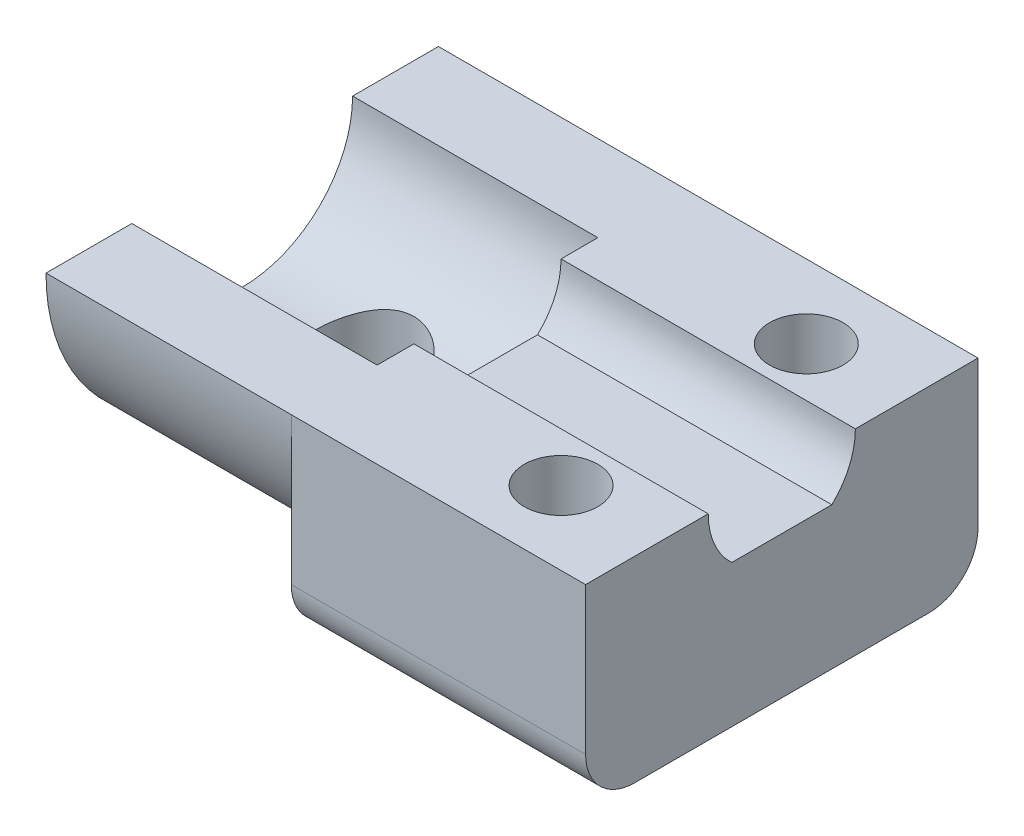
ISO-10303-21;
HEADER;
FILE_DESCRIPTION(('STEP AP214'),'2;1');
FILE_NAME('part.step','',(''),(''),'','','');
FILE_SCHEMA(('AUTOMOTIVE_DESIGN { 1 0 10303 214 1 1 1 1 }'));
ENDSEC;
DATA;
#1=APPLICATION_CONTEXT('core data for automotive mechanical design processes');
#2=APPLICATION_PROTOCOL_DEFINITION('international standard','automotive_design',2000,#1);
#3=PRODUCT_CONTEXT('',#1,'mechanical');
#4=PRODUCT('Part','Part','',(#3));
#5=PRODUCT_RELATED_PRODUCT_CATEGORY('part','',(#4));
#6=PRODUCT_DEFINITION_FORMATION('','',#4);
#7=PRODUCT_DEFINITION_CONTEXT('part definition',#1,'design');
#8=PRODUCT_DEFINITION('design','',#6,#7);
#9=PRODUCT_DEFINITION_SHAPE('','',#8);
#10=(LENGTH_UNIT() NAMED_UNIT(*) SI_UNIT(.MILLI.,.METRE.));
#11=(NAMED_UNIT(*) PLANE_ANGLE_UNIT() SI_UNIT($,.RADIAN.));
#12=(NAMED_UNIT(*) SI_UNIT($,.STERADIAN.) SOLID_ANGLE_UNIT());
#13=UNCERTAINTY_MEASURE_WITH_UNIT(LENGTH_MEASURE(1.E-05),#10,'distance_accuracy_value','');
#14=(GEOMETRIC_REPRESENTATION_CONTEXT(3) GLOBAL_UNCERTAINTY_ASSIGNED_CONTEXT((#13)) GLOBAL_UNIT_ASSIGNED_CONTEXT((#10,
#11,#12)) REPRESENTATION_CONTEXT('',''));
#15=CARTESIAN_POINT('',(0.,0.,0.));
#16=DIRECTION('',(0.,0.,1.));
#17=DIRECTION('',(1.,0.,0.));
#18=AXIS2_PLACEMENT_3D('',#15,#16,#17);
#19=CARTESIAN_POINT('',(-6.,8.,-8.00000000000001));
#20=DIRECTION('',(1.,0.,0.));
#21=DIRECTION('',(0.,0.,-1.));
#22=AXIS2_PLACEMENT_3D('',#19,#20,#21);
#23=PLANE('',#22);
#24=DIRECTION('',(0.,-1.,0.));
#25=VECTOR('',#24,1.);
#26=CARTESIAN_POINT('',(-6.,8.,-8.00000000000001));
#27=LINE('',#26,#25);
#28=CARTESIAN_POINT('',(-6.,8.,-8.00000000000001));
#29=VERTEX_POINT('',#28);
#30=CARTESIAN_POINT('',(-6.,2.,-8.00000000000001));
#31=VERTEX_POINT('',#30);
#32=EDGE_CURVE('E297',#29,#31,#27,.T.);
#33=ORIENTED_EDGE('',*,*,#32,.T.);
#34=CARTESIAN_POINT('',(-6.,2.,-6.00000000000001));
#35=DIRECTION('',(1.,0.,0.));
#36=DIRECTION('',(0.,0.,-1.));
#37=AXIS2_PLACEMENT_3D('',#34,#35,#36);
#38=CIRCLE('',#37,2.);
#39=CARTESIAN_POINT('',(-6.,0.,-6.00000000000001));
#40=VERTEX_POINT('',#39);
#41=EDGE_CURVE('E48',#31,#40,#38,.F.);
#42=ORIENTED_EDGE('',*,*,#41,.T.);
#43=DIRECTION('',(0.,0.,1.));
#44=VECTOR('',#43,1.);
#45=CARTESIAN_POINT('',(-6.,0.,-8.00000000000001));
#46=LINE('',#45,#44);
#47=CARTESIAN_POINT('',(-6.,0.,0.));
#48=VERTEX_POINT('',#47);
#49=EDGE_CURVE('E299',#40,#48,#46,.T.);
#50=ORIENTED_EDGE('',*,*,#49,.T.);
#51=CARTESIAN_POINT('',(-6.,8.,0.));
#52=DIRECTION('',(-1.,0.,0.));
#53=DIRECTION('',(0.,0.,1.));
#54=AXIS2_PLACEMENT_3D('',#51,#52,#53);
#55=CIRCLE('',#54,8.);
#56=EDGE_CURVE('E235',#29,#48,#55,.T.);
#57=ORIENTED_EDGE('',*,*,#56,.F.);
#58=EDGE_LOOP('',(#33,#42,#50,#57));
#59=FACE_BOUND('',#58,.T.);
#60=ADVANCED_FACE('F34',(#59),#23,.F.);
#61=CARTESIAN_POINT('',(-6.,0.,5.99999999999999));
#62=VERTEX_POINT('',#61);
#63=EDGE_CURVE('E301',#48,#62,#46,.T.);
#64=ORIENTED_EDGE('',*,*,#63,.T.);
#65=CARTESIAN_POINT('',(-6.,2.,5.99999999999999));
#66=DIRECTION('',(1.,0.,0.));
#67=DIRECTION('',(0.,0.,-1.));
#68=AXIS2_PLACEMENT_3D('',#65,#66,#67);
#69=CIRCLE('',#68,2.);
#70=CARTESIAN_POINT('',(-6.,2.,7.99999999999999));
#71=VERTEX_POINT('',#70);
#72=EDGE_CURVE('E342',#62,#71,#69,.F.);
#73=ORIENTED_EDGE('',*,*,#72,.T.);
#74=DIRECTION('',(0.,-1.,0.));
#75=VECTOR('',#74,1.);
#76=CARTESIAN_POINT('',(-6.,8.,7.99999999999999));
#77=LINE('',#76,#75);
#78=CARTESIAN_POINT('',(-6.,8.,7.99999999999999));
#79=VERTEX_POINT('',#78);
#80=EDGE_CURVE('E306',#79,#71,#77,.T.);
#81=ORIENTED_EDGE('',*,*,#80,.F.);
#82=EDGE_CURVE('E179',#48,#79,#55,.T.);
#83=ORIENTED_EDGE('',*,*,#82,.F.);
#84=EDGE_LOOP('',(#64,#73,#81,#83));
#85=FACE_BOUND('',#84,.T.);
#86=ADVANCED_FACE('F269',(#85),#23,.F.);
#87=CARTESIAN_POINT('',(-6.,8.,0.));
#88=DIRECTION('',(1.,0.,0.));
#89=DIRECTION('',(0.,0.,1.));
#90=AXIS2_PLACEMENT_3D('',#87,#88,#89);
#91=CIRCLE('',#90,4.5);
#92=CARTESIAN_POINT('',(-6.,8.,4.49999999999999));
#93=VERTEX_POINT('',#92);
#94=CARTESIAN_POINT('',(-6.,8.,-4.50000000000001));
#95=VERTEX_POINT('',#94);
#96=EDGE_CURVE('E173',#93,#95,#91,.T.);
#97=ORIENTED_EDGE('',*,*,#96,.F.);
#98=DIRECTION('',(0.,0.,1.));
#99=VECTOR('',#98,1.);
#100=CARTESIAN_POINT('',(-6.,8.,-8.00000000000001));
#101=LINE('',#100,#99);
#102=CARTESIAN_POINT('',(-6.,8.,3.));
#103=VERTEX_POINT('',#102);
#104=EDGE_CURVE('E222',#103,#93,#101,.T.);
#105=ORIENTED_EDGE('',*,*,#104,.F.);
#106=CARTESIAN_POINT('',(-6.,8.,0.));
#107=DIRECTION('',(1.,0.,0.));
#108=DIRECTION('',(0.,0.,-1.));
#109=AXIS2_PLACEMENT_3D('',#106,#107,#108);
#110=CIRCLE('',#109,3.);
#111=CARTESIAN_POINT('',(-6.,5.8,2.03960780543711));
#112=VERTEX_POINT('',#111);
#113=EDGE_CURVE('E325',#103,#112,#110,.T.);
#114=ORIENTED_EDGE('',*,*,#113,.T.);
#115=DIRECTION('',(0.,0.,-1.));
#116=VECTOR('',#115,1.);
#117=CARTESIAN_POINT('',(-6.,5.8,-8.00000000000001));
#118=LINE('',#117,#116);
#119=CARTESIAN_POINT('',(-6.,5.8,-2.03960780543711));
#120=VERTEX_POINT('',#119);
#121=EDGE_CURVE('E323',#112,#120,#118,.T.);
#122=ORIENTED_EDGE('',*,*,#121,.T.);
#123=CARTESIAN_POINT('',(-6.,8.,-3.));
#124=VERTEX_POINT('',#123);
#125=EDGE_CURVE('E309',#120,#124,#110,.T.);
#126=ORIENTED_EDGE('',*,*,#125,.T.);
#127=EDGE_CURVE('E229',#95,#124,#101,.T.);
#128=ORIENTED_EDGE('',*,*,#127,.F.);
#129=EDGE_LOOP('',(#97,#105,#114,#122,#126,#128));
#130=FACE_BOUND('',#129,.T.);
#131=ADVANCED_FACE('F272',(#130),#23,.F.);
#132=CARTESIAN_POINT('',(0.,8.,0.));
#133=DIRECTION('',(0.,1.,0.));
#134=DIRECTION('',(0.,0.,1.));
#135=AXIS2_PLACEMENT_3D('',#132,#133,#134);
#136=PLANE('',#135);
#137=DIRECTION('',(1.,0.,0.));
#138=VECTOR('',#137,1.);
#139=CARTESIAN_POINT('',(-19.,8.,3.));
#140=LINE('',#139,#138);
#141=CARTESIAN_POINT('',(6.,8.,3.));
#142=VERTEX_POINT('',#141);
#143=EDGE_CURVE('E196',#103,#142,#140,.T.);
#144=ORIENTED_EDGE('',*,*,#143,.F.);
#145=ORIENTED_EDGE('',*,*,#104,.T.);
#146=DIRECTION('',(1.,0.,0.));
#147=VECTOR('',#146,1.);
#148=CARTESIAN_POINT('',(-16.,8.,4.5));
#149=LINE('',#148,#147);
#150=CARTESIAN_POINT('',(-16.,8.,4.5));
#151=VERTEX_POINT('',#150);
#152=EDGE_CURVE('E160',#151,#93,#149,.T.);
#153=ORIENTED_EDGE('',*,*,#152,.F.);
#154=DIRECTION('',(0.,0.,-1.));
#155=VECTOR('',#154,1.);
#156=CARTESIAN_POINT('',(-16.,8.,4.5));
#157=LINE('',#156,#155);
#158=CARTESIAN_POINT('',(-16.,8.,8.));
#159=VERTEX_POINT('',#158);
#160=EDGE_CURVE('E151',#159,#151,#157,.T.);
#161=ORIENTED_EDGE('',*,*,#160,.F.);
#162=DIRECTION('',(1.,0.,0.));
#163=VECTOR('',#162,1.);
#164=CARTESIAN_POINT('',(-16.,8.,8.));
#165=LINE('',#164,#163);
#166=EDGE_CURVE('E157',#159,#79,#165,.T.);
#167=ORIENTED_EDGE('',*,*,#166,.T.);
#168=DIRECTION('',(1.,0.,0.));
#169=VECTOR('',#168,1.);
#170=CARTESIAN_POINT('',(-6.,8.,7.99999999999999));
#171=LINE('',#170,#169);
#172=CARTESIAN_POINT('',(6.,8.,7.99999999999999));
#173=VERTEX_POINT('',#172);
#174=EDGE_CURVE('E225',#79,#173,#171,.T.);
#175=ORIENTED_EDGE('',*,*,#174,.T.);
#176=DIRECTION('',(0.,0.,-1.));
#177=VECTOR('',#176,1.);
#178=CARTESIAN_POINT('',(6.,8.,-8.00000000000001));
#179=LINE('',#178,#177);
#180=EDGE_CURVE('E215',#173,#142,#179,.T.);
#181=ORIENTED_EDGE('',*,*,#180,.T.);
#182=EDGE_LOOP('',(#144,#145,#153,#161,#167,#175,#181));
#183=FACE_BOUND('',#182,.T.);
#184=CARTESIAN_POINT('',(2.,8.,5.));
#185=DIRECTION('',(0.,1.,0.));
#186=DIRECTION('',(0.,0.,-1.));
#187=AXIS2_PLACEMENT_3D('',#184,#185,#186);
#188=CIRCLE('',#187,1.5);
#189=CARTESIAN_POINT('',(2.,8.,3.5));
#190=VERTEX_POINT('',#189);
#191=EDGE_CURVE('E204',#190,#190,#188,.T.);
#192=ORIENTED_EDGE('',*,*,#191,.F.);
#193=EDGE_LOOP('',(#192));
#194=FACE_BOUND('',#193,.T.);
#195=ADVANCED_FACE('F154',(#183,#194),#136,.T.);
#196=DIRECTION('',(1.,0.,0.));
#197=VECTOR('',#196,1.);
#198=CARTESIAN_POINT('',(-19.,8.,-3.));
#199=LINE('',#198,#197);
#200=CARTESIAN_POINT('',(6.,8.,-3.));
#201=VERTEX_POINT('',#200);
#202=EDGE_CURVE('E200',#201,#124,#199,.F.);
#203=ORIENTED_EDGE('',*,*,#202,.F.);
#204=CARTESIAN_POINT('',(6.,8.,-8.00000000000001));
#205=VERTEX_POINT('',#204);
#206=EDGE_CURVE('E219',#201,#205,#179,.T.);
#207=ORIENTED_EDGE('',*,*,#206,.T.);
#208=DIRECTION('',(-1.,0.,0.));
#209=VECTOR('',#208,1.);
#210=CARTESIAN_POINT('',(-6.,8.,-8.00000000000001));
#211=LINE('',#210,#209);
#212=EDGE_CURVE('E218',#205,#29,#211,.T.);
#213=ORIENTED_EDGE('',*,*,#212,.T.);
#214=DIRECTION('',(1.,0.,0.));
#215=VECTOR('',#214,1.);
#216=CARTESIAN_POINT('',(-16.,8.,-8.));
#217=LINE('',#216,#215);
#218=CARTESIAN_POINT('',(-16.,8.,-8.));
#219=VERTEX_POINT('',#218);
#220=EDGE_CURVE('E187',#219,#29,#217,.T.);
#221=ORIENTED_EDGE('',*,*,#220,.F.);
#222=DIRECTION('',(0.,0.,-1.));
#223=VECTOR('',#222,1.);
#224=CARTESIAN_POINT('',(-16.,8.,-8.));
#225=LINE('',#224,#223);
#226=CARTESIAN_POINT('',(-16.,8.,-4.5));
#227=VERTEX_POINT('',#226);
#228=EDGE_CURVE('E169',#227,#219,#225,.T.);
#229=ORIENTED_EDGE('',*,*,#228,.F.);
#230=DIRECTION('',(1.,0.,0.));
#231=VECTOR('',#230,1.);
#232=CARTESIAN_POINT('',(-16.,8.,-4.5));
#233=LINE('',#232,#231);
#234=EDGE_CURVE('E184',#227,#95,#233,.T.);
#235=ORIENTED_EDGE('',*,*,#234,.T.);
#236=ORIENTED_EDGE('',*,*,#127,.T.);
#237=EDGE_LOOP('',(#203,#207,#213,#221,#229,#235,#236));
#238=FACE_BOUND('',#237,.T.);
#239=CARTESIAN_POINT('',(2.,8.,-5.));
#240=DIRECTION('',(0.,1.,0.));
#241=DIRECTION('',(0.,0.,1.));
#242=AXIS2_PLACEMENT_3D('',#239,#240,#241);
#243=CIRCLE('',#242,1.5);
#244=CARTESIAN_POINT('',(2.,8.,-3.5));
#245=VERTEX_POINT('',#244);
#246=EDGE_CURVE('E209',#245,#245,#243,.T.);
#247=ORIENTED_EDGE('',*,*,#246,.F.);
#248=EDGE_LOOP('',(#247));
#249=FACE_BOUND('',#248,.T.);
#250=ADVANCED_FACE('F285',(#238,#249),#136,.T.);
#251=CARTESIAN_POINT('',(0.,0.,0.));
#252=DIRECTION('',(0.,1.,0.));
#253=DIRECTION('',(0.,0.,1.));
#254=AXIS2_PLACEMENT_3D('',#251,#252,#253);
#255=PLANE('',#254);
#256=DIRECTION('',(0.,0.,-1.));
#257=VECTOR('',#256,1.);
#258=CARTESIAN_POINT('',(6.,0.,-8.00000000000001));
#259=LINE('',#258,#257);
#260=CARTESIAN_POINT('',(6.,0.,5.99999999999999));
#261=VERTEX_POINT('',#260);
#262=CARTESIAN_POINT('',(6.,0.,-6.00000000000001));
#263=VERTEX_POINT('',#262);
#264=EDGE_CURVE('E212',#261,#263,#259,.T.);
#265=ORIENTED_EDGE('',*,*,#264,.F.);
#266=DIRECTION('',(1.,0.,0.));
#267=VECTOR('',#266,1.);
#268=CARTESIAN_POINT('',(0.,0.,5.99999999999999));
#269=LINE('',#268,#267);
#270=CARTESIAN_POINT('',(3.1180339887499,0.,5.99999999999999));
#271=VERTEX_POINT('',#270);
#272=EDGE_CURVE('E62',#261,#271,#269,.F.);
#273=ORIENTED_EDGE('',*,*,#272,.T.);
#274=CARTESIAN_POINT('',(2.,0.,5.));
#275=DIRECTION('',(0.,1.,0.));
#276=DIRECTION('',(0.,0.,-1.));
#277=AXIS2_PLACEMENT_3D('',#274,#275,#276);
#278=CIRCLE('',#277,1.5);
#279=CARTESIAN_POINT('',(0.881966011250093,0.,5.99999999999999));
#280=VERTEX_POINT('',#279);
#281=EDGE_CURVE('E203',#271,#280,#278,.T.);
#282=ORIENTED_EDGE('',*,*,#281,.T.);
#283=DIRECTION('',(1.,0.,0.));
#284=VECTOR('',#283,1.);
#285=CARTESIAN_POINT('',(0.,0.,5.99999999999999));
#286=LINE('',#285,#284);
#287=EDGE_CURVE('E312',#280,#62,#286,.F.);
#288=ORIENTED_EDGE('',*,*,#287,.T.);
#289=ORIENTED_EDGE('',*,*,#63,.F.);
#290=ORIENTED_EDGE('',*,*,#49,.F.);
#291=DIRECTION('',(-1.,0.,0.));
#292=VECTOR('',#291,1.);
#293=CARTESIAN_POINT('',(0.,0.,-6.00000000000001));
#294=LINE('',#293,#292);
#295=CARTESIAN_POINT('',(0.881966011250103,0.,-6.00000000000001));
#296=VERTEX_POINT('',#295);
#297=EDGE_CURVE('E383',#40,#296,#294,.F.);
#298=ORIENTED_EDGE('',*,*,#297,.T.);
#299=CARTESIAN_POINT('',(2.,0.,-5.));
#300=DIRECTION('',(0.,1.,0.));
#301=DIRECTION('',(0.,0.,1.));
#302=AXIS2_PLACEMENT_3D('',#299,#300,#301);
#303=CIRCLE('',#302,1.5);
#304=CARTESIAN_POINT('',(3.11803398874989,0.,-6.00000000000001));
#305=VERTEX_POINT('',#304);
#306=EDGE_CURVE('E207',#296,#305,#303,.T.);
#307=ORIENTED_EDGE('',*,*,#306,.T.);
#308=DIRECTION('',(-1.,0.,0.));
#309=VECTOR('',#308,1.);
#310=CARTESIAN_POINT('',(0.,0.,-6.00000000000001));
#311=LINE('',#310,#309);
#312=EDGE_CURVE('E381',#305,#263,#311,.F.);
#313=ORIENTED_EDGE('',*,*,#312,.T.);
#314=EDGE_LOOP('',(#265,#273,#282,#288,#289,#290,#298,#307,#313));
#315=FACE_BOUND('',#314,.T.);
#316=ADVANCED_FACE('F310',(#315),#255,.F.);
#317=CARTESIAN_POINT('',(6.,8.,-8.00000000000001));
#318=DIRECTION('',(-1.,0.,0.));
#319=DIRECTION('',(0.,0.,1.));
#320=AXIS2_PLACEMENT_3D('',#317,#318,#319);
#321=PLANE('',#320);
#322=DIRECTION('',(0.,-1.,0.));
#323=VECTOR('',#322,1.);
#324=CARTESIAN_POINT('',(6.,8.,7.99999999999999));
#325=LINE('',#324,#323);
#326=CARTESIAN_POINT('',(6.,2.,7.99999999999999));
#327=VERTEX_POINT('',#326);
#328=EDGE_CURVE('E315',#173,#327,#325,.T.);
#329=ORIENTED_EDGE('',*,*,#328,.T.);
#330=CARTESIAN_POINT('',(6.,2.,5.99999999999999));
#331=DIRECTION('',(-1.,0.,0.));
#332=DIRECTION('',(0.,0.,1.));
#333=AXIS2_PLACEMENT_3D('',#330,#331,#332);
#334=CIRCLE('',#333,2.);
#335=EDGE_CURVE('E374',#327,#261,#334,.F.);
#336=ORIENTED_EDGE('',*,*,#335,.T.);
#337=ORIENTED_EDGE('',*,*,#264,.T.);
#338=CARTESIAN_POINT('',(6.,2.,-6.00000000000001));
#339=DIRECTION('',(-1.,0.,0.));
#340=DIRECTION('',(0.,0.,1.));
#341=AXIS2_PLACEMENT_3D('',#338,#339,#340);
#342=CIRCLE('',#341,2.);
#343=CARTESIAN_POINT('',(6.,2.,-8.00000000000001));
#344=VERTEX_POINT('',#343);
#345=EDGE_CURVE('E336',#263,#344,#342,.F.);
#346=ORIENTED_EDGE('',*,*,#345,.T.);
#347=DIRECTION('',(0.,-1.,0.));
#348=VECTOR('',#347,1.);
#349=CARTESIAN_POINT('',(6.,8.,-8.00000000000001));
#350=LINE('',#349,#348);
#351=EDGE_CURVE('E320',#205,#344,#350,.T.);
#352=ORIENTED_EDGE('',*,*,#351,.F.);
#353=ORIENTED_EDGE('',*,*,#206,.F.);
#354=CARTESIAN_POINT('',(6.,8.,0.));
#355=DIRECTION('',(1.,0.,0.));
#356=DIRECTION('',(0.,0.,-1.));
#357=AXIS2_PLACEMENT_3D('',#354,#355,#356);
#358=CIRCLE('',#357,3.);
#359=CARTESIAN_POINT('',(6.,5.8,-2.03960780543711));
#360=VERTEX_POINT('',#359);
#361=EDGE_CURVE('E182',#360,#201,#358,.T.);
#362=ORIENTED_EDGE('',*,*,#361,.F.);
#363=DIRECTION('',(0.,0.,-1.));
#364=VECTOR('',#363,1.);
#365=CARTESIAN_POINT('',(6.,5.8,2.03960780543711));
#366=LINE('',#365,#364);
#367=CARTESIAN_POINT('',(6.,5.8,2.03960780543711));
#368=VERTEX_POINT('',#367);
#369=EDGE_CURVE('E190',#368,#360,#366,.T.);
#370=ORIENTED_EDGE('',*,*,#369,.F.);
#371=EDGE_CURVE('E180',#142,#368,#358,.T.);
#372=ORIENTED_EDGE('',*,*,#371,.F.);
#373=ORIENTED_EDGE('',*,*,#180,.F.);
#374=EDGE_LOOP('',(#329,#336,#337,#346,#352,#353,#362,#370,#372,#373));
#375=FACE_BOUND('',#374,.T.);
#376=ADVANCED_FACE('F333',(#375),#321,.F.);
#377=CARTESIAN_POINT('',(-6.,8.,-8.00000000000001));
#378=DIRECTION('',(0.,0.,1.));
#379=DIRECTION('',(1.,0.,0.));
#380=AXIS2_PLACEMENT_3D('',#377,#378,#379);
#381=PLANE('',#380);
#382=ORIENTED_EDGE('',*,*,#351,.T.);
#383=DIRECTION('',(-1.,0.,0.));
#384=VECTOR('',#383,1.);
#385=CARTESIAN_POINT('',(-6.,2.,-8.00000000000001));
#386=LINE('',#385,#384);
#387=EDGE_CURVE('E339',#344,#31,#386,.T.);
#388=ORIENTED_EDGE('',*,*,#387,.T.);
#389=ORIENTED_EDGE('',*,*,#32,.F.);
#390=ORIENTED_EDGE('',*,*,#212,.F.);
#391=EDGE_LOOP('',(#382,#388,#389,#390));
#392=FACE_BOUND('',#391,.T.);
#393=ADVANCED_FACE('F338',(#392),#381,.F.);
#394=CARTESIAN_POINT('',(-6.,8.,7.99999999999999));
#395=DIRECTION('',(0.,0.,-1.));
#396=DIRECTION('',(-1.,0.,0.));
#397=AXIS2_PLACEMENT_3D('',#394,#395,#396);
#398=PLANE('',#397);
#399=ORIENTED_EDGE('',*,*,#80,.T.);
#400=DIRECTION('',(1.,0.,0.));
#401=VECTOR('',#400,1.);
#402=CARTESIAN_POINT('',(-6.,2.,7.99999999999999));
#403=LINE('',#402,#401);
#404=EDGE_CURVE('E308',#71,#327,#403,.T.);
#405=ORIENTED_EDGE('',*,*,#404,.T.);
#406=ORIENTED_EDGE('',*,*,#328,.F.);
#407=ORIENTED_EDGE('',*,*,#174,.F.);
#408=EDGE_LOOP('',(#399,#405,#406,#407));
#409=FACE_BOUND('',#408,.T.);
#410=ADVANCED_FACE('F357',(#409),#398,.F.);
#411=CARTESIAN_POINT('',(2.,8.,-5.));
#412=DIRECTION('',(0.,-1.,0.));
#413=DIRECTION('',(0.,0.,-1.));
#414=AXIS2_PLACEMENT_3D('',#411,#412,#413);
#415=CYLINDRICAL_SURFACE('',#414,1.5);
#416=ORIENTED_EDGE('',*,*,#246,.T.);
#417=EDGE_LOOP('',(#416));
#418=FACE_BOUND('',#417,.T.);
#419=ORIENTED_EDGE('',*,*,#306,.F.);
#420=CARTESIAN_POINT('',(0.881966011250103,0.,-6.00000000000001));
#421=CARTESIAN_POINT('',(0.909852870208019,3.34381618091055E-08,-6.03117993307877));
#422=CARTESIAN_POINT('',(0.939026050503092,0.000729006026754949,-6.06116906465174));
#423=CARTESIAN_POINT('',(0.99973205183235,0.00331150134637052,-6.11857446137418));
#424=CARTESIAN_POINT('',(1.03126373321367,0.0051644839821915,-6.14599195491375));
#425=CARTESIAN_POINT('',(1.12901320814408,0.0119038967252394,-6.22405879240334));
#426=CARTESIAN_POINT('',(1.19847754744362,0.0179729629821858,-6.27062516140012));
#427=CARTESIAN_POINT('',(1.34401037870398,0.0307067222945277,-6.35152253492339));
#428=CARTESIAN_POINT('',(1.4200730237211,0.0373708881663646,-6.38586423707524));
#429=CARTESIAN_POINT('',(1.57694662089693,0.0491324450014541,-6.44150740643657));
#430=CARTESIAN_POINT('',(1.65775640032691,0.0542302210018207,-6.46281207958036));
#431=CARTESIAN_POINT('',(1.82279080569854,0.0613683123778577,-6.49187394491755));
#432=CARTESIAN_POINT('',(1.90704215692493,0.0633763675757608,-6.49948833166414));
#433=CARTESIAN_POINT('',(2.0756265112548,0.0636273603889948,-6.50046160542908));
#434=CARTESIAN_POINT('',(2.15995950575895,0.0618706588322447,-6.49382185861508));
#435=CARTESIAN_POINT('',(2.32380374590473,0.0552206252820339,-6.46691770394057));
#436=CARTESIAN_POINT('',(2.40338391174117,0.0504180784706839,-6.44704683775241));
#437=CARTESIAN_POINT('',(2.55815299334985,0.0391490231975796,-6.3946862227213));
#438=CARTESIAN_POINT('',(2.63334030666766,0.0326819121177559,-6.3621919016659));
#439=CARTESIAN_POINT('',(2.78279797686597,0.0196183980260593,-6.28253608857842));
#440=CARTESIAN_POINT('',(2.85659712716037,0.0130472663989348,-6.23447406430958));
#441=CARTESIAN_POINT('',(2.96024049746162,0.00569090400603687,-6.15320339567816));
#442=CARTESIAN_POINT('',(2.99364637405499,0.00365461773011248,-6.12454571346391));
#443=CARTESIAN_POINT('',(3.05785530182102,0.000808895581902934,-6.06436745825547));
#444=CARTESIAN_POINT('',(3.08865711455305,4.03862934001377E-08,-6.03284553770814));
#445=CARTESIAN_POINT('',(3.11803398874989,0.,-6.00000000000001));
#446=B_SPLINE_CURVE_WITH_KNOTS('',3,(#420,#421,#422,#423,#424,#425,#426,#427,#428,#429,#430,
#431,#432,#433,#434,#435,#436,#437,#438,#439,#440,#441,#442,#443,#444,#445),.UNSPECIFIED.,.F.,
.F.,(4,2,2,2,2,2,2,2,2,2,2,2,4),(0.,0.125397644041449,0.250735081258053,0.501001621551559,
0.751048615773059,1.00103409623093,1.25361240915332,1.5061665151383,1.75152561203566,
1.99697366092298,2.26041347354053,2.39243416742389,2.52451729859242),.UNSPECIFIED.);
#447=EDGE_CURVE('E11',#296,#305,#446,.T.);
#448=ORIENTED_EDGE('',*,*,#447,.T.);
#449=EDGE_LOOP('',(#419,#448));
#450=FACE_BOUND('',#449,.T.);
#451=ADVANCED_FACE('F352',(#418,#450),#415,.F.);
#452=CARTESIAN_POINT('',(2.,8.,5.));
#453=DIRECTION('',(0.,-1.,0.));
#454=DIRECTION('',(0.,0.,-1.));
#455=AXIS2_PLACEMENT_3D('',#452,#453,#454);
#456=CYLINDRICAL_SURFACE('',#455,1.5);
#457=ORIENTED_EDGE('',*,*,#191,.T.);
#458=EDGE_LOOP('',(#457));
#459=FACE_BOUND('',#458,.T.);
#460=ORIENTED_EDGE('',*,*,#281,.F.);
#461=CARTESIAN_POINT('',(3.1180339887499,0.,5.99999999999999));
#462=CARTESIAN_POINT('',(3.09014712979198,3.34381622203825E-08,6.03117993307876));
#463=CARTESIAN_POINT('',(3.06097394949691,0.000729006026755375,6.06116906465173));
#464=CARTESIAN_POINT('',(3.00026794816766,0.00331150134637071,6.11857446137417));
#465=CARTESIAN_POINT('',(2.96873626678633,0.00516448398219145,6.14599195491374));
#466=CARTESIAN_POINT('',(2.87098679185593,0.011903896725239,6.22405879240334));
#467=CARTESIAN_POINT('',(2.80152245255639,0.0179729629821856,6.27062516140011));
#468=CARTESIAN_POINT('',(2.65598962129603,0.0307067222945281,6.35152253492339));
#469=CARTESIAN_POINT('',(2.57992697627891,0.0373708881663651,6.38586423707524));
#470=CARTESIAN_POINT('',(2.42305337910308,0.049132445001455,6.44150740643656));
#471=CARTESIAN_POINT('',(2.3422435996731,0.054230221001822,6.46281207958035));
#472=CARTESIAN_POINT('',(2.17720919430147,0.0613683123778598,6.49187394491755));
#473=CARTESIAN_POINT('',(2.09295784307508,0.0633763675757634,6.49948833166414));
#474=CARTESIAN_POINT('',(1.92437348874521,0.0636273603889981,6.50046160542908));
#475=CARTESIAN_POINT('',(1.84004049424106,0.0618706588322481,6.49382185861508));
#476=CARTESIAN_POINT('',(1.67619625409528,0.0552206252820374,6.46691770394058));
#477=CARTESIAN_POINT('',(1.59661608825884,0.0504180784706875,6.44704683775242));
#478=CARTESIAN_POINT('',(1.44184700665016,0.0391490231975829,6.39468622272131));
#479=CARTESIAN_POINT('',(1.36665969333235,0.0326819121177591,6.36219190166591));
#480=CARTESIAN_POINT('',(1.21720202313403,0.0196183980260616,6.28253608857843));
#481=CARTESIAN_POINT('',(1.14340287283963,0.0130472663989365,6.23447406430958));
#482=CARTESIAN_POINT('',(1.03975950253838,0.00569090400603735,6.15320339567816));
#483=CARTESIAN_POINT('',(1.006353625945,0.00365461773011251,6.1245457134639));
#484=CARTESIAN_POINT('',(0.94214469817897,0.00080889558190254,6.06436745825546));
#485=CARTESIAN_POINT('',(0.911342885446933,4.03862930331467E-08,6.03284553770813));
#486=CARTESIAN_POINT('',(0.881966011250093,0.,5.99999999999999));
#487=B_SPLINE_CURVE_WITH_KNOTS('',3,(#461,#462,#463,#464,#465,#466,#467,#468,#469,#470,#471,
#472,#473,#474,#475,#476,#477,#478,#479,#480,#481,#482,#483,#484,#485,#486),.UNSPECIFIED.,.F.,
.F.,(4,2,2,2,2,2,2,2,2,2,2,2,4),(0.,0.125397644041448,0.250735081258052,0.501001621551559,
0.751048615773058,1.00103409623093,1.25361240915332,1.5061665151383,1.75152561203566,
1.99697366092298,2.26041347354055,2.39243416742391,2.52451729859245),.UNSPECIFIED.);
#488=EDGE_CURVE('E345',#271,#280,#487,.T.);
#489=ORIENTED_EDGE('',*,*,#488,.T.);
#490=EDGE_LOOP('',(#460,#489));
#491=FACE_BOUND('',#490,.T.);
#492=ADVANCED_FACE('F356',(#459,#491),#456,.F.);
#493=CARTESIAN_POINT('',(-19.,8.,0.));
#494=DIRECTION('',(1.,0.,0.));
#495=DIRECTION('',(0.,0.,-1.));
#496=AXIS2_PLACEMENT_3D('',#493,#494,#495);
#497=CYLINDRICAL_SURFACE('',#496,3.);
#498=ORIENTED_EDGE('',*,*,#202,.T.);
#499=ORIENTED_EDGE('',*,*,#125,.F.);
#500=DIRECTION('',(1.,0.,0.));
#501=VECTOR('',#500,1.);
#502=CARTESIAN_POINT('',(-19.,5.8,-2.03960780543711));
#503=LINE('',#502,#501);
#504=EDGE_CURVE('E194',#120,#360,#503,.T.);
#505=ORIENTED_EDGE('',*,*,#504,.T.);
#506=ORIENTED_EDGE('',*,*,#361,.T.);
#507=EDGE_LOOP('',(#498,#499,#505,#506));
#508=FACE_BOUND('',#507,.T.);
#509=ADVANCED_FACE('F328',(#508),#497,.F.);
#510=CARTESIAN_POINT('',(-19.,5.8,2.03960780543711));
#511=DIRECTION('',(0.,-1.,0.));
#512=DIRECTION('',(0.,0.,-1.));
#513=AXIS2_PLACEMENT_3D('',#510,#511,#512);
#514=PLANE('',#513);
#515=DIRECTION('',(1.,0.,0.));
#516=VECTOR('',#515,1.);
#517=CARTESIAN_POINT('',(-19.,5.8,2.03960780543711));
#518=LINE('',#517,#516);
#519=EDGE_CURVE('E193',#112,#368,#518,.T.);
#520=ORIENTED_EDGE('',*,*,#519,.T.);
#521=ORIENTED_EDGE('',*,*,#369,.T.);
#522=ORIENTED_EDGE('',*,*,#504,.F.);
#523=ORIENTED_EDGE('',*,*,#121,.F.);
#524=EDGE_LOOP('',(#520,#521,#522,#523));
#525=FACE_BOUND('',#524,.T.);
#526=ADVANCED_FACE('F502',(#525),#514,.F.);
#527=ORIENTED_EDGE('',*,*,#143,.T.);
#528=ORIENTED_EDGE('',*,*,#371,.T.);
#529=ORIENTED_EDGE('',*,*,#519,.F.);
#530=ORIENTED_EDGE('',*,*,#113,.F.);
#531=EDGE_LOOP('',(#527,#528,#529,#530));
#532=FACE_BOUND('',#531,.T.);
#533=ADVANCED_FACE('F264',(#532),#497,.F.);
#534=CARTESIAN_POINT('',(-16.,8.,0.));
#535=DIRECTION('',(1.,0.,0.));
#536=DIRECTION('',(0.,0.,-1.));
#537=AXIS2_PLACEMENT_3D('',#534,#535,#536);
#538=CYLINDRICAL_SURFACE('',#537,8.);
#539=CARTESIAN_POINT('',(-11.,0.254033307585167,2.));
#540=CARTESIAN_POINT('',(-10.8895593992587,0.254031199297121,1.99999686287446));
#541=CARTESIAN_POINT('',(-10.7790840810572,0.251645551883223,1.99082099639812));
#542=CARTESIAN_POINT('',(-10.5613059374612,0.242385104059489,1.95441850037103));
#543=CARTESIAN_POINT('',(-10.4540049964255,0.235507691026961,1.92718136539368));
#544=CARTESIAN_POINT('',(-10.2457571694503,0.218090203230799,1.85559295970563));
#545=CARTESIAN_POINT('',(-10.1448022756914,0.207554858476339,1.81126378228359));
#546=CARTESIAN_POINT('',(-9.95175131796809,0.184014463769931,1.70681691300911));
#547=CARTESIAN_POINT('',(-9.85965563033582,0.17100930897209,1.64669855084855));
#548=CARTESIAN_POINT('',(-9.68491068379023,0.143674269155003,1.5109667418495));
#549=CARTESIAN_POINT('',(-9.60248511971996,0.12932321901573,1.43506951016324));
#550=CARTESIAN_POINT('',(-9.45139088451173,0.101096995877652,1.27054565128053));
#551=CARTESIAN_POINT('',(-9.3827234995026,0.087221867468894,1.18191783534424));
#552=CARTESIAN_POINT('',(-9.26017962589498,0.0612766758353409,0.992916160863163));
#553=CARTESIAN_POINT('',(-9.20652288947083,0.0492345007952616,0.892395660956095));
#554=CARTESIAN_POINT('',(-9.11695228467753,0.0285535045921315,0.68341054743421));
#555=CARTESIAN_POINT('',(-9.08103579846759,0.0199141813252447,0.574947108633552));
#556=CARTESIAN_POINT('',(-9.02868173233713,0.00716192921455826,0.35548700700333));
#557=CARTESIAN_POINT('',(-9.01186428453873,0.00296084924548775,0.244586175639181));
#558=CARTESIAN_POINT('',(-8.99699329657956,-0.000748752858380082,0.0214630554102154));
#559=CARTESIAN_POINT('',(-8.99893698223232,-0.000257968773629372,-0.0907590356304549));
#560=CARTESIAN_POINT('',(-9.02125988020012,0.00529524037172365,-0.310704494344775));
#561=CARTESIAN_POINT('',(-9.04122906004308,0.0102559812730081,-0.418472431202134));
#562=CARTESIAN_POINT('',(-9.0983770160388,0.0240733078011673,-0.629076494827373));
#563=CARTESIAN_POINT('',(-9.13555670830193,0.032930100812473,-0.731912358740876));
#564=CARTESIAN_POINT('',(-9.22640205654965,0.0536999223928357,-0.930813407003613));
#565=CARTESIAN_POINT('',(-9.2802136357294,0.0656398424395711,-1.02680901953301));
#566=CARTESIAN_POINT('',(-9.40268454329301,0.0912807695228054,-1.20855124468098));
#567=CARTESIAN_POINT('',(-9.4713464548485,0.104982082780078,-1.29429607017101));
#568=CARTESIAN_POINT('',(-9.6237669935859,0.133090289843834,-1.45554807016991));
#569=CARTESIAN_POINT('',(-9.70788391387822,0.147506243792656,-1.5307153581504));
#570=CARTESIAN_POINT('',(-9.8876799788322,0.175079651866347,-1.66595275192604));
#571=CARTESIAN_POINT('',(-9.9833596635928,0.188237047152235,-1.72602215209203));
#572=CARTESIAN_POINT('',(-10.1842320273192,0.211836025346813,-1.8295762580452));
#573=CARTESIAN_POINT('',(-10.2894685842506,0.222264130194235,-1.87297913394098));
#574=CARTESIAN_POINT('',(-10.5060683744612,0.239050878880343,-1.94137124127268));
#575=CARTESIAN_POINT('',(-10.6174302911865,0.245410393518251,-1.96636441310582));
#576=CARTESIAN_POINT('',(-10.8399676012185,0.253157151686873,-1.99666371093214));
#577=CARTESIAN_POINT('',(-10.9510702346637,0.254671287250814,-2.0024723791357));
#578=CARTESIAN_POINT('',(-11.1726575492625,0.252901252151685,-1.99561359241244));
#579=CARTESIAN_POINT('',(-11.283142286361,0.249617523189872,-1.98294783827904));
#580=CARTESIAN_POINT('',(-11.4984914119638,0.238743344363516,-1.93994037115013));
#581=CARTESIAN_POINT('',(-11.6034181812567,0.231224238124999,-1.9098912546254));
#582=CARTESIAN_POINT('',(-11.8067451662813,0.212794253832301,-1.8332944653365));
#583=CARTESIAN_POINT('',(-11.9051446072443,0.201882974011093,-1.78674483817004));
#584=CARTESIAN_POINT('',(-12.0947530222939,0.1776309032539,-1.67741653434925));
#585=CARTESIAN_POINT('',(-12.1857830720345,0.164246651146866,-1.6143374030685));
#586=CARTESIAN_POINT('',(-12.3561506902411,0.136663335426272,-1.47412058586891));
#587=CARTESIAN_POINT('',(-12.4354863333201,0.122464138172237,-1.39698058961088));
#588=CARTESIAN_POINT('',(-12.5822488340568,0.0944207757471509,-1.22852544196945));
#589=CARTESIAN_POINT('',(-12.649328050039,0.0805943835053164,-1.13690390506319));
#590=CARTESIAN_POINT('',(-12.767148693561,0.0552222670901257,-0.943405365389352));
#591=CARTESIAN_POINT('',(-12.8178909732866,0.043676423968311,-0.841528897915183));
#592=CARTESIAN_POINT('',(-12.9011568276223,0.024239074093496,-0.631116403462182));
#593=CARTESIAN_POINT('',(-12.9338114275033,0.0163213598207514,-0.522634762055765));
#594=CARTESIAN_POINT('',(-12.9803682676867,0.0049176528336641,-0.301499520637614));
#595=CARTESIAN_POINT('',(-12.9942741269912,0.00143080485261919,-0.188846730082481));
#596=CARTESIAN_POINT('',(-13.0027351791511,-0.000683388176115341,0.0341670528866465));
#597=CARTESIAN_POINT('',(-12.9978034181908,0.000560422400233041,0.144507653932044));
#598=CARTESIAN_POINT('',(-12.9699043454113,0.00748207085113355,0.362734992829502));
#599=CARTESIAN_POINT('',(-12.9469375699737,0.0131597768566212,0.470621803561857));
#600=CARTESIAN_POINT('',(-12.8838955604583,0.0282913429222192,0.680342071289547));
#601=CARTESIAN_POINT('',(-12.8439130933712,0.0377247099521534,0.782204989161724));
#602=CARTESIAN_POINT('',(-12.7480588419609,0.0593742217268435,0.977834106083247));
#603=CARTESIAN_POINT('',(-12.692185054659,0.071590717224849,1.07159928253127));
#604=CARTESIAN_POINT('',(-12.5645695320077,0.0978550063942587,1.25080385684661));
#605=CARTESIAN_POINT('',(-12.4924797141923,0.111939661166709,1.33598997659667));
#606=CARTESIAN_POINT('',(-12.3351542960453,0.140187018856207,1.49323004054701));
#607=CARTESIAN_POINT('',(-12.2499153677777,0.154349740653956,1.56528065015318));
#608=CARTESIAN_POINT('',(-12.0667971716211,0.181450483089953,1.69552405294366));
#609=CARTESIAN_POINT('',(-11.9687117532695,0.194360726534226,1.75343323883276));
#610=CARTESIAN_POINT('',(-11.7638890202504,0.217120890103442,1.85185379317094));
#611=CARTESIAN_POINT('',(-11.6571580678123,0.226973035335726,1.8923778195043));
#612=CARTESIAN_POINT('',(-11.4588459763297,0.240961824985255,1.948845057142));
#613=CARTESIAN_POINT('',(-11.3682136712277,0.245826739930024,1.96798634119376));
#614=CARTESIAN_POINT('',(-11.1850622620046,0.252363228347599,1.99356458514354));
#615=CARTESIAN_POINT('',(-11.0925433195112,0.254035074217846,2.0000026287435));
#616=CARTESIAN_POINT('',(-11.,0.254033307585167,2.));
#617=B_SPLINE_CURVE_WITH_KNOTS('',3,(#539,#540,#541,#542,#543,#544,#545,#546,#547,#548,#549,
#550,#551,#552,#553,#554,#555,#556,#557,#558,#559,#560,#561,#562,#563,#564,#565,#566,#567,#568,
#569,#570,#571,#572,#573,#574,#575,#576,#577,#578,#579,#580,#581,#582,#583,#584,#585,#586,#587,
#588,#589,#590,#591,#592,#593,#594,#595,#596,#597,#598,#599,#600,#601,#602,#603,#604,#605,#606,
#607,#608,#609,#610,#611,#612,#613,#614,#615,#616),.UNSPECIFIED.,.T.,.F.,(4,2,2,2,2,2,2,2,2,2,2,
2,2,2,2,2,2,2,2,2,2,2,2,2,2,2,2,2,2,2,2,2,2,2,2,2,2,2,4),(0.,0.330981953388908,
0.662156593142933,0.992904581732817,1.32366661404383,1.66099163354381,1.99834817183893,
2.34041197118336,2.68242527877674,3.01751000796277,3.35254518932816,3.68014610151158,
4.00776445379829,4.33834299403556,4.66897908375131,5.00856373257529,5.34816424959842,
5.68941145606722,6.03058560103638,6.36274859809373,6.69488101747041,7.02157924007365,
7.34831617137134,7.68146276687326,8.01466415108036,8.35620264772255,8.69772332575642,
9.03673658245543,9.3756843912723,9.70546756901965,10.0352409390158,10.3632390124777,
10.6912784459046,11.0271767726566,11.3631602525241,11.7054118182895,12.0474137709606,
12.3247826174462,12.6021278008238),.UNSPECIFIED.);
#618=CARTESIAN_POINT('',(-11.,0.254033307585167,2.));
#619=VERTEX_POINT('',#618);
#620=EDGE_CURVE('E240',#619,#619,#617,.T.);
#621=ORIENTED_EDGE('',*,*,#620,.T.);
#622=EDGE_LOOP('',(#621));
#623=FACE_BOUND('',#622,.T.);
#624=ORIENTED_EDGE('',*,*,#56,.T.);
#625=ORIENTED_EDGE('',*,*,#82,.T.);
#626=ORIENTED_EDGE('',*,*,#166,.F.);
#627=CARTESIAN_POINT('',(-16.,8.,0.));
#628=DIRECTION('',(-1.,0.,0.));
#629=DIRECTION('',(0.,0.,1.));
#630=AXIS2_PLACEMENT_3D('',#627,#628,#629);
#631=CIRCLE('',#630,8.);
#632=EDGE_CURVE('E164',#219,#159,#631,.T.);
#633=ORIENTED_EDGE('',*,*,#632,.F.);
#634=ORIENTED_EDGE('',*,*,#220,.T.);
#635=EDGE_LOOP('',(#624,#625,#626,#633,#634));
#636=FACE_BOUND('',#635,.T.);
#637=ADVANCED_FACE('F177',(#623,#636),#538,.T.);
#638=CARTESIAN_POINT('',(-16.,8.,0.));
#639=DIRECTION('',(1.,0.,0.));
#640=DIRECTION('',(0.,0.,-1.));
#641=AXIS2_PLACEMENT_3D('',#638,#639,#640);
#642=CYLINDRICAL_SURFACE('',#641,4.5);
#643=CARTESIAN_POINT('',(-11.,3.96887112585073,2.));
#644=CARTESIAN_POINT('',(-11.1059039924636,3.96886547548089,1.99999484594597));
#645=CARTESIAN_POINT('',(-11.2119795996325,3.96463705804319,1.99153456492499));
#646=CARTESIAN_POINT('',(-11.4210072465631,3.94829474414436,1.95806387980205));
#647=CARTESIAN_POINT('',(-11.5239506734598,3.93616085734235,1.93301151710034));
#648=CARTESIAN_POINT('',(-11.723313338247,3.90567345271624,1.86755853428819));
#649=CARTESIAN_POINT('',(-11.8197594413833,3.88734770720564,1.82722635239745));
#650=CARTESIAN_POINT('',(-12.0044914799075,3.84658361116902,1.73256417141065));
#651=CARTESIAN_POINT('',(-12.0927785666441,3.82414584224285,1.67823615142948));
#652=CARTESIAN_POINT('',(-12.2650052935959,3.77590670385018,1.55300187975662));
#653=CARTESIAN_POINT('',(-12.348297620891,3.74998174063049,1.48125258977568));
#654=CARTESIAN_POINT('',(-12.5021536205031,3.69869834527911,1.32497757269255));
#655=CARTESIAN_POINT('',(-12.5727119749215,3.67334015369518,1.2404465346985));
#656=CARTESIAN_POINT('',(-12.7025636211869,3.62450948685554,1.05576770225946));
#657=CARTESIAN_POINT('',(-12.7611070852107,3.60119715199244,0.955046452033094));
#658=CARTESIAN_POINT('',(-12.8601331622652,3.56062538087193,0.743958871221187));
#659=CARTESIAN_POINT('',(-12.9006248435621,3.54336290641718,0.633597416766131));
#660=CARTESIAN_POINT('',(-12.9599846690375,3.51771639983294,0.413179116234487));
#661=CARTESIAN_POINT('',(-12.9799749407441,3.50887379250111,0.3034789509025));
#662=CARTESIAN_POINT('',(-13.0014123472432,3.49938306483102,0.0819497402518935));
#663=CARTESIAN_POINT('',(-13.0028681155662,3.4987311292096,-0.0298782895756736));
#664=CARTESIAN_POINT('',(-12.9877350949949,3.50544137235455,-0.244244557868432));
#665=CARTESIAN_POINT('',(-12.9723857028631,3.51225312455095,-0.346890946724227));
#666=CARTESIAN_POINT('',(-12.9262317741487,3.53234525223463,-0.54797315940561));
#667=CARTESIAN_POINT('',(-12.895426092902,3.54562610680954,-0.646408670795351));
#668=CARTESIAN_POINT('',(-12.8189025534726,3.57764943335133,-0.838099771163664));
#669=CARTESIAN_POINT('',(-12.7729645358954,3.59647207484933,-0.931253524892281));
#670=CARTESIAN_POINT('',(-12.6677162408816,3.6377829933051,-1.1087748570991));
#671=CARTESIAN_POINT('',(-12.608401089057,3.6602726056118,-1.19313921645632));
#672=CARTESIAN_POINT('',(-12.4726812602381,3.70879200180519,-1.35774229377343));
#673=CARTESIAN_POINT('',(-12.3952998486753,3.73496110321737,-1.43713566088823));
#674=CARTESIAN_POINT('',(-12.2283466849694,3.78662388297177,-1.58221507620133));
#675=CARTESIAN_POINT('',(-12.1387689013079,3.81211721962604,-1.64789430131822));
#676=CARTESIAN_POINT('',(-11.9453045958576,3.86061737067709,-1.76629057836327));
#677=CARTESIAN_POINT('',(-11.8409774248624,3.88347634175362,-1.81835359742707));
#678=CARTESIAN_POINT('',(-11.6237566643806,3.92229118065773,-1.90381701793594));
#679=CARTESIAN_POINT('',(-11.5108702568131,3.93825276225115,-1.93723287331884));
#680=CARTESIAN_POINT('',(-11.2882292428088,3.95998860112542,-1.9821432698382));
#681=CARTESIAN_POINT('',(-11.178817663439,3.96640343203427,-1.99502086541624));
#682=CARTESIAN_POINT('',(-10.9592321050781,3.9701569966405,-2.00259620883453));
#683=CARTESIAN_POINT('',(-10.8490584776167,3.96749966857843,-1.99730184514968));
#684=CARTESIAN_POINT('',(-10.6400739179791,3.95407710963817,-1.9699494980693));
#685=CARTESIAN_POINT('',(-10.5410425166109,3.94395381750586,-1.94921757343237));
#686=CARTESIAN_POINT('',(-10.3479758283871,3.91760159881032,-1.89340129461148));
#687=CARTESIAN_POINT('',(-10.2539418294648,3.90137110692139,-1.85831326063664));
#688=CARTESIAN_POINT('',(-10.068816065036,3.86375645698504,-1.77306102505114));
#689=CARTESIAN_POINT('',(-9.97804423998264,3.84217418585207,-1.72229246607407));
#690=CARTESIAN_POINT('',(-9.80583637883681,3.79653493897597,-1.60769475573616));
#691=CARTESIAN_POINT('',(-9.72440476292378,3.77247680168298,-1.54385946011281));
#692=CARTESIAN_POINT('',(-9.56512190413512,3.72184170117306,-1.39781173505947));
#693=CARTESIAN_POINT('',(-9.48834569488662,3.6952425717971,-1.31442959872367));
#694=CARTESIAN_POINT('',(-9.3496360598186,3.64459811194521,-1.13539501053381));
#695=CARTESIAN_POINT('',(-9.28770473174882,3.62055314266803,-1.03974082742925));
#696=CARTESIAN_POINT('',(-9.18015659878323,3.57740145212047,-0.837490433503255));
#697=CARTESIAN_POINT('',(-9.13468374867651,3.55833869161434,-0.730807693966861));
#698=CARTESIAN_POINT('',(-9.06270826930199,3.52763710576687,-0.510229197222846));
#699=CARTESIAN_POINT('',(-9.03619262223197,3.51599318654898,-0.396338448325892));
#700=CARTESIAN_POINT('',(-9.00468315829993,3.50209931183,-0.174114257540389));
#701=CARTESIAN_POINT('',(-8.99817959057199,3.4991907946577,-0.0660349235271269));
#702=CARTESIAN_POINT('',(-9.00269486016947,3.50119781595818,0.149670109771012));
#703=CARTESIAN_POINT('',(-9.01370981911538,3.50611162266793,0.257295904175135));
#704=CARTESIAN_POINT('',(-9.05187240223488,3.52284373850242,0.464076759386734));
#705=CARTESIAN_POINT('',(-9.07828250736506,3.5343460092302,0.563395782335503));
#706=CARTESIAN_POINT('',(-9.14562380951106,3.56290815001181,0.756117953240566));
#707=CARTESIAN_POINT('',(-9.1865575538781,3.57996899496023,0.849520060019421));
#708=CARTESIAN_POINT('',(-9.28384853306578,3.61900666767027,1.03249711326246));
#709=CARTESIAN_POINT('',(-9.34082668649361,3.64117297109051,1.12170044113602));
#710=CARTESIAN_POINT('',(-9.4677339975565,3.68788216049865,1.28967159585994));
#711=CARTESIAN_POINT('',(-9.53766863477277,3.71242604991653,1.36843498316278));
#712=CARTESIAN_POINT('',(-9.69496474390807,3.76359092018951,1.51977383040585));
#713=CARTESIAN_POINT('',(-9.78326504887417,3.7902232130091,1.59137303071498));
#714=CARTESIAN_POINT('',(-9.97134870362504,3.84068129084806,1.71895030628896));
#715=CARTESIAN_POINT('',(-10.0711391708953,3.8645053176205,1.77491862481392));
#716=CARTESIAN_POINT('',(-10.2802554189549,3.90640604857515,1.86954298278749));
#717=CARTESIAN_POINT('',(-10.3896163268006,3.9244603432878,1.90813175234942));
#718=CARTESIAN_POINT('',(-10.6141907205399,3.95196903210722,1.96583263626088));
#719=CARTESIAN_POINT('',(-10.7293831868239,3.9614522728447,1.98501010736528));
#720=CARTESIAN_POINT('',(-10.871056487628,3.96689292713119,1.99600731357988));
#721=CARTESIAN_POINT('',(-10.8968137431868,3.96763314809385,1.99750308217234));
#722=CARTESIAN_POINT('',(-10.9483772655488,3.96862294287697,1.99950006721468));
#723=CARTESIAN_POINT('',(-10.9741835336756,3.96887250325473,2.00000125641592));
#724=CARTESIAN_POINT('',(-11.,3.96887112585073,2.));
#725=B_SPLINE_CURVE_WITH_KNOTS('',3,(#643,#644,#645,#646,#647,#648,#649,#650,#651,#652,#653,
#654,#655,#656,#657,#658,#659,#660,#661,#662,#663,#664,#665,#666,#667,#668,#669,#670,#671,#672,
#673,#674,#675,#676,#677,#678,#679,#680,#681,#682,#683,#684,#685,#686,#687,#688,#689,#690,#691,
#692,#693,#694,#695,#696,#697,#698,#699,#700,#701,#702,#703,#704,#705,#706,#707,#708,#709,#710,
#711,#712,#713,#714,#715,#716,#717,#718,#719,#720,#721,#722,#723,#724),.UNSPECIFIED.,.T.,.F.,(4,
2,2,2,2,2,2,2,2,2,2,2,2,2,2,2,2,2,2,2,2,2,2,2,2,2,2,2,2,2,2,2,2,2,2,2,2,2,2,2,4),(0.,
0.31760334437537,0.636012936965872,0.953012920070959,1.26996810161855,1.60735896091121,
1.94489039529369,2.29948552911719,2.65390233172428,2.98767546043324,3.3212931090692,
3.63186770859037,3.94246531208843,4.25779759386061,4.57324496324738,4.91348424244389,
5.25389239679148,5.60848267098925,5.96277863847742,6.29202080550634,6.62112006609385,
6.92480624185223,7.22857030796274,7.54592692136879,7.86343310695169,8.21110201111792,
8.55882001591001,8.90950977437051,9.2599584842858,9.58322590889841,9.9064217761665,
10.2152769219976,10.5241862657993,10.8472538994055,11.1704584786024,11.5191241833328,
11.8680070399787,12.2182289273672,12.5672676750844,12.6446884712522,12.7221113884988),.UNSPECIFIED.);
#726=CARTESIAN_POINT('',(-11.,3.96887112585073,2.));
#727=VERTEX_POINT('',#726);
#728=EDGE_CURVE('E39',#727,#727,#725,.T.);
#729=ORIENTED_EDGE('',*,*,#728,.T.);
#730=EDGE_LOOP('',(#729));
#731=FACE_BOUND('',#730,.T.);
#732=ORIENTED_EDGE('',*,*,#96,.T.);
#733=ORIENTED_EDGE('',*,*,#234,.F.);
#734=CARTESIAN_POINT('',(-16.,8.,0.));
#735=DIRECTION('',(1.,0.,0.));
#736=DIRECTION('',(0.,0.,1.));
#737=AXIS2_PLACEMENT_3D('',#734,#735,#736);
#738=CIRCLE('',#737,4.5);
#739=EDGE_CURVE('E163',#151,#227,#738,.T.);
#740=ORIENTED_EDGE('',*,*,#739,.F.);
#741=ORIENTED_EDGE('',*,*,#152,.T.);
#742=EDGE_LOOP('',(#732,#733,#740,#741));
#743=FACE_BOUND('',#742,.T.);
#744=ADVANCED_FACE('F257',(#731,#743),#642,.F.);
#745=CARTESIAN_POINT('',(-16.,8.,0.));
#746=DIRECTION('',(-1.,0.,0.));
#747=DIRECTION('',(0.,0.,1.));
#748=AXIS2_PLACEMENT_3D('',#745,#746,#747);
#749=PLANE('',#748);
#750=ORIENTED_EDGE('',*,*,#632,.T.);
#751=ORIENTED_EDGE('',*,*,#160,.T.);
#752=ORIENTED_EDGE('',*,*,#739,.T.);
#753=ORIENTED_EDGE('',*,*,#228,.T.);
#754=EDGE_LOOP('',(#750,#751,#752,#753));
#755=FACE_BOUND('',#754,.T.);
#756=ADVANCED_FACE('F167',(#755),#749,.T.);
#757=CARTESIAN_POINT('',(-6.,2.,5.99999999999999));
#758=DIRECTION('',(1.,0.,0.));
#759=DIRECTION('',(0.,0.,-1.));
#760=AXIS2_PLACEMENT_3D('',#757,#758,#759);
#761=CYLINDRICAL_SURFACE('',#760,2.);
#762=ORIENTED_EDGE('',*,*,#488,.F.);
#763=ORIENTED_EDGE('',*,*,#272,.F.);
#764=ORIENTED_EDGE('',*,*,#335,.F.);
#765=ORIENTED_EDGE('',*,*,#404,.F.);
#766=ORIENTED_EDGE('',*,*,#72,.F.);
#767=ORIENTED_EDGE('',*,*,#287,.F.);
#768=EDGE_LOOP('',(#762,#763,#764,#765,#766,#767));
#769=FACE_BOUND('',#768,.T.);
#770=ADVANCED_FACE('F256',(#769),#761,.T.);
#771=CARTESIAN_POINT('',(-6.,2.,-6.00000000000001));
#772=DIRECTION('',(-1.,0.,0.));
#773=DIRECTION('',(0.,0.,1.));
#774=AXIS2_PLACEMENT_3D('',#771,#772,#773);
#775=CYLINDRICAL_SURFACE('',#774,2.);
#776=ORIENTED_EDGE('',*,*,#447,.F.);
#777=ORIENTED_EDGE('',*,*,#297,.F.);
#778=ORIENTED_EDGE('',*,*,#41,.F.);
#779=ORIENTED_EDGE('',*,*,#387,.F.);
#780=ORIENTED_EDGE('',*,*,#345,.F.);
#781=ORIENTED_EDGE('',*,*,#312,.F.);
#782=EDGE_LOOP('',(#776,#777,#778,#779,#780,#781));
#783=FACE_BOUND('',#782,.T.);
#784=ADVANCED_FACE('F36',(#783),#775,.T.);
#785=CARTESIAN_POINT('',(-11.,-12.,0.));
#786=DIRECTION('',(0.,1.,0.));
#787=DIRECTION('',(0.,0.,1.));
#788=AXIS2_PLACEMENT_3D('',#785,#786,#787);
#789=CYLINDRICAL_SURFACE('',#788,2.);
#790=ORIENTED_EDGE('',*,*,#728,.F.);
#791=EDGE_LOOP('',(#790));
#792=FACE_BOUND('',#791,.T.);
#793=ORIENTED_EDGE('',*,*,#620,.F.);
#794=EDGE_LOOP('',(#793));
#795=FACE_BOUND('',#794,.T.);
#796=ADVANCED_FACE('F249',(#792,#795),#789,.F.);
#797=CLOSED_SHELL('',(#60,#86,#131,#195,#250,#316,#376,#393,#410,#451,#492,#509,#526,#533,#637,
#744,#756,#770,#784,#796));
#798=MANIFOLD_SOLID_BREP('B2',#797);
#799=ADVANCED_BREP_SHAPE_REPRESENTATION('',(#18,#798),#14);
#800=SHAPE_DEFINITION_REPRESENTATION(#9,#799);
ENDSEC;
END-ISO-10303-21;
